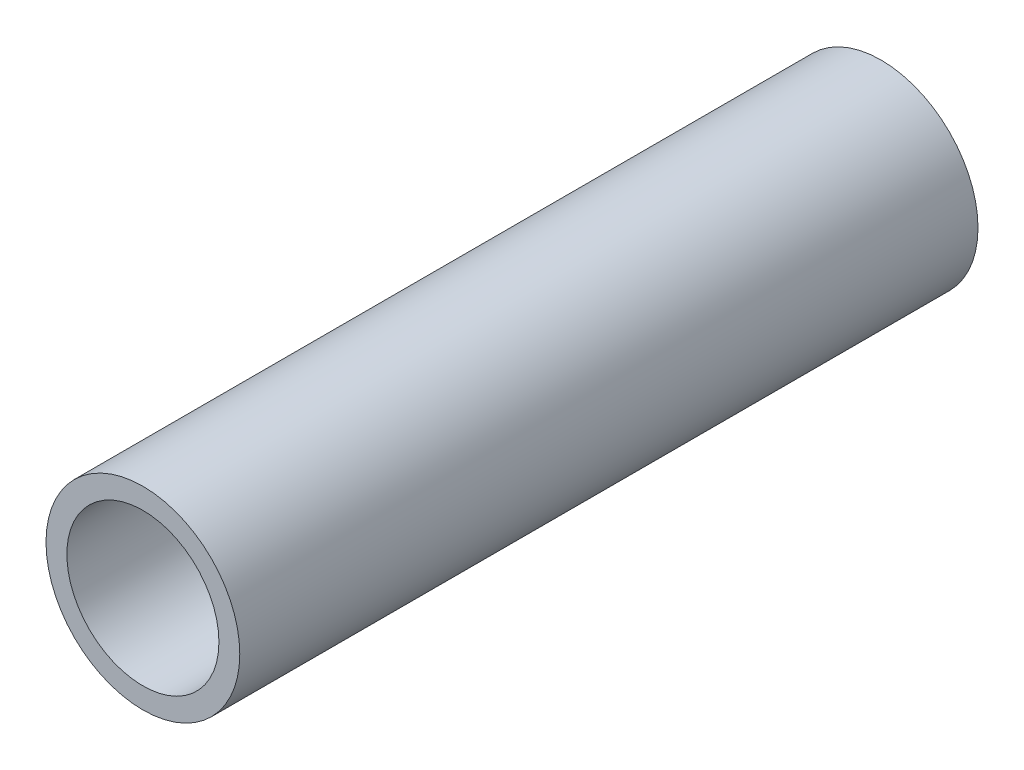
ISO-10303-21;
HEADER;
FILE_DESCRIPTION(('STEP AP214'),'2;1');
FILE_NAME('part.step','',(''),(''),'','','');
FILE_SCHEMA(('AUTOMOTIVE_DESIGN { 1 0 10303 214 1 1 1 1 }'));
ENDSEC;
DATA;
#1=APPLICATION_CONTEXT('core data for automotive mechanical design processes');
#2=APPLICATION_PROTOCOL_DEFINITION('international standard','automotive_design',2000,#1);
#3=PRODUCT_CONTEXT('',#1,'mechanical');
#4=PRODUCT('Part','Part','',(#3));
#5=PRODUCT_RELATED_PRODUCT_CATEGORY('part','',(#4));
#6=PRODUCT_DEFINITION_FORMATION('','',#4);
#7=PRODUCT_DEFINITION_CONTEXT('part definition',#1,'design');
#8=PRODUCT_DEFINITION('design','',#6,#7);
#9=PRODUCT_DEFINITION_SHAPE('','',#8);
#10=(LENGTH_UNIT() NAMED_UNIT(*) SI_UNIT(.MILLI.,.METRE.));
#11=(NAMED_UNIT(*) PLANE_ANGLE_UNIT() SI_UNIT($,.RADIAN.));
#12=(NAMED_UNIT(*) SI_UNIT($,.STERADIAN.) SOLID_ANGLE_UNIT());
#13=UNCERTAINTY_MEASURE_WITH_UNIT(LENGTH_MEASURE(1.E-05),#10,'distance_accuracy_value','');
#14=(GEOMETRIC_REPRESENTATION_CONTEXT(3) GLOBAL_UNCERTAINTY_ASSIGNED_CONTEXT((#13)) GLOBAL_UNIT_ASSIGNED_CONTEXT((#10,
#11,#12)) REPRESENTATION_CONTEXT('',''));
#15=CARTESIAN_POINT('',(0.,0.,0.));
#16=DIRECTION('',(0.,0.,1.));
#17=DIRECTION('',(1.,0.,0.));
#18=AXIS2_PLACEMENT_3D('',#15,#16,#17);
#19=CARTESIAN_POINT('',(0.,0.,50.8));
#20=DIRECTION('',(0.,0.,1.));
#21=DIRECTION('',(1.,0.,0.));
#22=AXIS2_PLACEMENT_3D('',#19,#20,#21);
#23=PLANE('',#22);
#24=CARTESIAN_POINT('',(0.,0.,50.8));
#25=DIRECTION('',(0.,0.,1.));
#26=DIRECTION('',(1.,0.,0.));
#27=AXIS2_PLACEMENT_3D('',#24,#25,#26);
#28=CIRCLE('',#27,13.335);
#29=CARTESIAN_POINT('',(13.335,0.,50.8));
#30=VERTEX_POINT('',#29);
#31=EDGE_CURVE('E10',#30,#30,#28,.T.);
#32=ORIENTED_EDGE('',*,*,#31,.T.);
#33=EDGE_LOOP('',(#32));
#34=FACE_BOUND('',#33,.T.);
#35=CARTESIAN_POINT('',(0.,0.,50.8));
#36=DIRECTION('',(0.,0.,1.));
#37=DIRECTION('',(1.,0.,0.));
#38=AXIS2_PLACEMENT_3D('',#35,#36,#37);
#39=CIRCLE('',#38,10.4648);
#40=CARTESIAN_POINT('',(10.4648,0.,50.8));
#41=VERTEX_POINT('',#40);
#42=EDGE_CURVE('E42',#41,#41,#39,.T.);
#43=ORIENTED_EDGE('',*,*,#42,.F.);
#44=EDGE_LOOP('',(#43));
#45=FACE_BOUND('',#44,.T.);
#46=ADVANCED_FACE('F31',(#34,#45),#23,.T.);
#47=CARTESIAN_POINT('',(0.,0.,-50.8));
#48=DIRECTION('',(0.,0.,1.));
#49=DIRECTION('',(1.,0.,0.));
#50=AXIS2_PLACEMENT_3D('',#47,#48,#49);
#51=PLANE('',#50);
#52=CARTESIAN_POINT('',(0.,0.,-50.8));
#53=DIRECTION('',(0.,0.,1.));
#54=DIRECTION('',(1.,0.,0.));
#55=AXIS2_PLACEMENT_3D('',#52,#53,#54);
#56=CIRCLE('',#55,13.335);
#57=CARTESIAN_POINT('',(13.335,0.,-50.8));
#58=VERTEX_POINT('',#57);
#59=EDGE_CURVE('E35',#58,#58,#56,.T.);
#60=ORIENTED_EDGE('',*,*,#59,.F.);
#61=EDGE_LOOP('',(#60));
#62=FACE_BOUND('',#61,.T.);
#63=CARTESIAN_POINT('',(0.,0.,-50.8));
#64=DIRECTION('',(0.,0.,1.));
#65=DIRECTION('',(1.,0.,0.));
#66=AXIS2_PLACEMENT_3D('',#63,#64,#65);
#67=CIRCLE('',#66,10.4648);
#68=CARTESIAN_POINT('',(10.4648,0.,-50.8));
#69=VERTEX_POINT('',#68);
#70=EDGE_CURVE('E44',#69,#69,#67,.T.);
#71=ORIENTED_EDGE('',*,*,#70,.T.);
#72=EDGE_LOOP('',(#71));
#73=FACE_BOUND('',#72,.T.);
#74=ADVANCED_FACE('F54',(#62,#73),#51,.F.);
#75=CARTESIAN_POINT('',(0.,0.,50.8));
#76=DIRECTION('',(0.,0.,-1.));
#77=DIRECTION('',(-1.,0.,0.));
#78=AXIS2_PLACEMENT_3D('',#75,#76,#77);
#79=CYLINDRICAL_SURFACE('',#78,13.335);
#80=ORIENTED_EDGE('',*,*,#31,.F.);
#81=EDGE_LOOP('',(#80));
#82=FACE_BOUND('',#81,.T.);
#83=ORIENTED_EDGE('',*,*,#59,.T.);
#84=EDGE_LOOP('',(#83));
#85=FACE_BOUND('',#84,.T.);
#86=ADVANCED_FACE('F33',(#82,#85),#79,.T.);
#87=CARTESIAN_POINT('',(0.,0.,50.8));
#88=DIRECTION('',(0.,0.,-1.));
#89=DIRECTION('',(-1.,0.,0.));
#90=AXIS2_PLACEMENT_3D('',#87,#88,#89);
#91=CYLINDRICAL_SURFACE('',#90,10.4648);
#92=ORIENTED_EDGE('',*,*,#42,.T.);
#93=EDGE_LOOP('',(#92));
#94=FACE_BOUND('',#93,.T.);
#95=ORIENTED_EDGE('',*,*,#70,.F.);
#96=EDGE_LOOP('',(#95));
#97=FACE_BOUND('',#96,.T.);
#98=ADVANCED_FACE('F50',(#94,#97),#91,.F.);
#99=CLOSED_SHELL('',(#46,#74,#86,#98));
#100=MANIFOLD_SOLID_BREP('B2',#99);
#101=ADVANCED_BREP_SHAPE_REPRESENTATION('',(#18,#100),#14);
#102=SHAPE_DEFINITION_REPRESENTATION(#9,#101);
ENDSEC;
END-ISO-10303-21;
